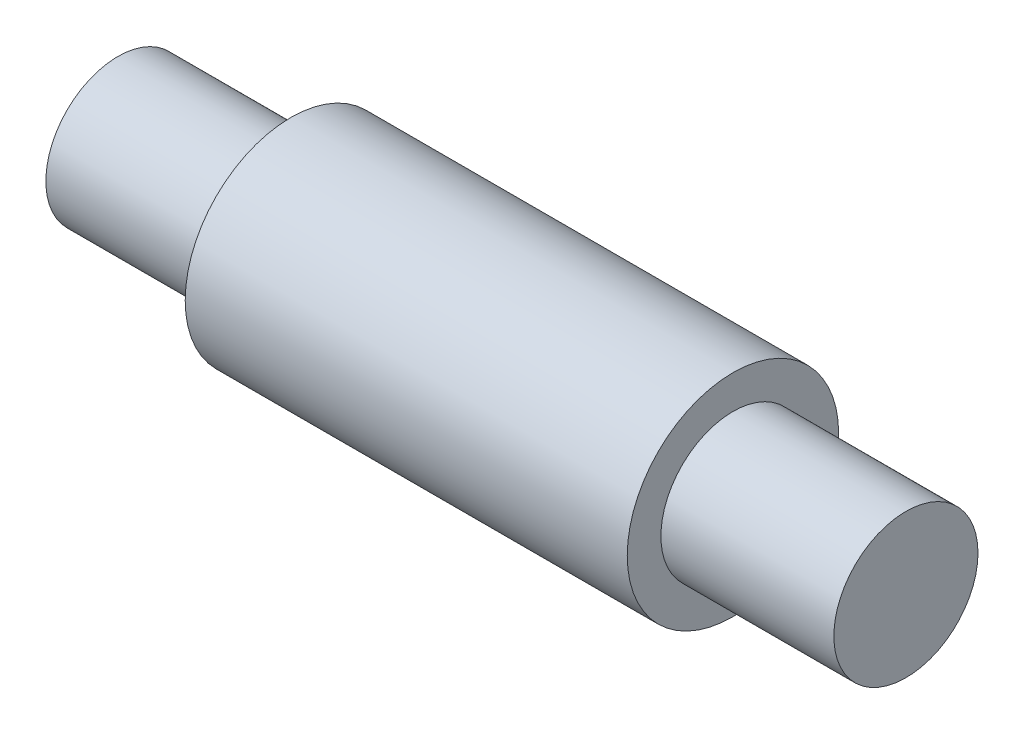
ISO-10303-21;
HEADER;
FILE_DESCRIPTION(('STEP AP214'),'2;1');
FILE_NAME('part.step','',(''),(''),'','','');
FILE_SCHEMA(('AUTOMOTIVE_DESIGN { 1 0 10303 214 1 1 1 1 }'));
ENDSEC;
DATA;
#1=APPLICATION_CONTEXT('core data for automotive mechanical design processes');
#2=APPLICATION_PROTOCOL_DEFINITION('international standard','automotive_design',2000,#1);
#3=PRODUCT_CONTEXT('',#1,'mechanical');
#4=PRODUCT('Part','Part','',(#3));
#5=PRODUCT_RELATED_PRODUCT_CATEGORY('part','',(#4));
#6=PRODUCT_DEFINITION_FORMATION('','',#4);
#7=PRODUCT_DEFINITION_CONTEXT('part definition',#1,'design');
#8=PRODUCT_DEFINITION('design','',#6,#7);
#9=PRODUCT_DEFINITION_SHAPE('','',#8);
#10=(LENGTH_UNIT() NAMED_UNIT(*) SI_UNIT(.MILLI.,.METRE.));
#11=(NAMED_UNIT(*) PLANE_ANGLE_UNIT() SI_UNIT($,.RADIAN.));
#12=(NAMED_UNIT(*) SI_UNIT($,.STERADIAN.) SOLID_ANGLE_UNIT());
#13=UNCERTAINTY_MEASURE_WITH_UNIT(LENGTH_MEASURE(1.E-05),#10,'distance_accuracy_value','');
#14=(GEOMETRIC_REPRESENTATION_CONTEXT(3) GLOBAL_UNCERTAINTY_ASSIGNED_CONTEXT((#13)) GLOBAL_UNIT_ASSIGNED_CONTEXT((#10,
#11,#12)) REPRESENTATION_CONTEXT('',''));
#15=CARTESIAN_POINT('',(0.,0.,0.));
#16=DIRECTION('',(0.,0.,1.));
#17=DIRECTION('',(1.,0.,0.));
#18=AXIS2_PLACEMENT_3D('',#15,#16,#17);
#19=CARTESIAN_POINT('',(41.,0.,0.));
#20=DIRECTION('',(-1.,0.,0.));
#21=DIRECTION('',(0.,0.,1.));
#22=AXIS2_PLACEMENT_3D('',#19,#20,#21);
#23=CYLINDRICAL_SURFACE('',#22,7.5);
#24=CARTESIAN_POINT('',(23.,0.,0.));
#25=DIRECTION('',(1.,0.,0.));
#26=DIRECTION('',(0.,0.,-1.));
#27=AXIS2_PLACEMENT_3D('',#24,#25,#26);
#28=CIRCLE('',#27,7.5);
#29=CARTESIAN_POINT('',(23.,0.,-7.5));
#30=VERTEX_POINT('',#29);
#31=EDGE_CURVE('E60',#30,#30,#28,.T.);
#32=ORIENTED_EDGE('',*,*,#31,.T.);
#33=EDGE_LOOP('',(#32));
#34=FACE_BOUND('',#33,.T.);
#35=CARTESIAN_POINT('',(41.,0.,0.));
#36=DIRECTION('',(1.,0.,0.));
#37=DIRECTION('',(0.,0.,-1.));
#38=AXIS2_PLACEMENT_3D('',#35,#36,#37);
#39=CIRCLE('',#38,7.5);
#40=CARTESIAN_POINT('',(41.,0.,-7.5));
#41=VERTEX_POINT('',#40);
#42=EDGE_CURVE('E46',#41,#41,#39,.T.);
#43=ORIENTED_EDGE('',*,*,#42,.F.);
#44=EDGE_LOOP('',(#43));
#45=FACE_BOUND('',#44,.T.);
#46=ADVANCED_FACE('F40',(#34,#45),#23,.T.);
#47=CARTESIAN_POINT('',(41.,0.,0.));
#48=DIRECTION('',(1.,0.,0.));
#49=DIRECTION('',(0.,0.,-1.));
#50=AXIS2_PLACEMENT_3D('',#47,#48,#49);
#51=PLANE('',#50);
#52=ORIENTED_EDGE('',*,*,#42,.T.);
#53=EDGE_LOOP('',(#52));
#54=FACE_BOUND('',#53,.T.);
#55=ADVANCED_FACE('F71',(#54),#51,.T.);
#56=CARTESIAN_POINT('',(23.,0.,0.));
#57=DIRECTION('',(1.,0.,0.));
#58=DIRECTION('',(0.,0.,-1.));
#59=AXIS2_PLACEMENT_3D('',#56,#57,#58);
#60=PLANE('',#59);
#61=CARTESIAN_POINT('',(23.,0.,0.));
#62=DIRECTION('',(1.,0.,0.));
#63=DIRECTION('',(0.,0.,-1.));
#64=AXIS2_PLACEMENT_3D('',#61,#62,#63);
#65=CIRCLE('',#64,11.);
#66=CARTESIAN_POINT('',(23.,0.,-11.));
#67=VERTEX_POINT('',#66);
#68=EDGE_CURVE('E55',#67,#67,#65,.T.);
#69=ORIENTED_EDGE('',*,*,#68,.T.);
#70=EDGE_LOOP('',(#69));
#71=FACE_BOUND('',#70,.T.);
#72=ORIENTED_EDGE('',*,*,#31,.F.);
#73=EDGE_LOOP('',(#72));
#74=FACE_BOUND('',#73,.T.);
#75=ADVANCED_FACE('F68',(#71,#74),#60,.T.);
#76=CARTESIAN_POINT('',(-23.,0.,0.));
#77=DIRECTION('',(1.,0.,0.));
#78=DIRECTION('',(0.,0.,-1.));
#79=AXIS2_PLACEMENT_3D('',#76,#77,#78);
#80=PLANE('',#79);
#81=CARTESIAN_POINT('',(-23.,0.,0.));
#82=DIRECTION('',(1.,0.,0.));
#83=DIRECTION('',(0.,0.,-1.));
#84=AXIS2_PLACEMENT_3D('',#81,#82,#83);
#85=CIRCLE('',#84,11.);
#86=CARTESIAN_POINT('',(-23.,0.,-11.));
#87=VERTEX_POINT('',#86);
#88=EDGE_CURVE('E57',#87,#87,#85,.T.);
#89=ORIENTED_EDGE('',*,*,#88,.F.);
#90=EDGE_LOOP('',(#89));
#91=FACE_BOUND('',#90,.T.);
#92=CARTESIAN_POINT('',(-23.,0.,0.));
#93=DIRECTION('',(1.,0.,0.));
#94=DIRECTION('',(0.,0.,-1.));
#95=AXIS2_PLACEMENT_3D('',#92,#93,#94);
#96=CIRCLE('',#95,7.5);
#97=CARTESIAN_POINT('',(-23.,0.,-7.5));
#98=VERTEX_POINT('',#97);
#99=EDGE_CURVE('E10',#98,#98,#96,.T.);
#100=ORIENTED_EDGE('',*,*,#99,.T.);
#101=EDGE_LOOP('',(#100));
#102=FACE_BOUND('',#101,.T.);
#103=ADVANCED_FACE('F70',(#91,#102),#80,.F.);
#104=CARTESIAN_POINT('',(23.,0.,0.));
#105=DIRECTION('',(-1.,0.,0.));
#106=DIRECTION('',(0.,0.,1.));
#107=AXIS2_PLACEMENT_3D('',#104,#105,#106);
#108=CYLINDRICAL_SURFACE('',#107,11.);
#109=ORIENTED_EDGE('',*,*,#68,.F.);
#110=EDGE_LOOP('',(#109));
#111=FACE_BOUND('',#110,.T.);
#112=ORIENTED_EDGE('',*,*,#88,.T.);
#113=EDGE_LOOP('',(#112));
#114=FACE_BOUND('',#113,.T.);
#115=ADVANCED_FACE('F78',(#111,#114),#108,.T.);
#116=CARTESIAN_POINT('',(-41.,0.,0.));
#117=DIRECTION('',(1.,0.,0.));
#118=DIRECTION('',(0.,0.,-1.));
#119=AXIS2_PLACEMENT_3D('',#116,#117,#118);
#120=PLANE('',#119);
#121=CARTESIAN_POINT('',(-41.,0.,0.));
#122=DIRECTION('',(1.,0.,0.));
#123=DIRECTION('',(0.,0.,-1.));
#124=AXIS2_PLACEMENT_3D('',#121,#122,#123);
#125=CIRCLE('',#124,7.5);
#126=CARTESIAN_POINT('',(-41.,0.,-7.5));
#127=VERTEX_POINT('',#126);
#128=EDGE_CURVE('E50',#127,#127,#125,.T.);
#129=ORIENTED_EDGE('',*,*,#128,.F.);
#130=EDGE_LOOP('',(#129));
#131=FACE_BOUND('',#130,.T.);
#132=ADVANCED_FACE('F87',(#131),#120,.F.);
#133=ORIENTED_EDGE('',*,*,#128,.T.);
#134=EDGE_LOOP('',(#133));
#135=FACE_BOUND('',#134,.T.);
#136=ORIENTED_EDGE('',*,*,#99,.F.);
#137=EDGE_LOOP('',(#136));
#138=FACE_BOUND('',#137,.T.);
#139=ADVANCED_FACE('F83',(#135,#138),#23,.T.);
#140=CLOSED_SHELL('',(#46,#55,#75,#103,#115,#132,#139));
#141=MANIFOLD_SOLID_BREP('B2',#140);
#142=ADVANCED_BREP_SHAPE_REPRESENTATION('',(#18,#141),#14);
#143=SHAPE_DEFINITION_REPRESENTATION(#9,#142);
ENDSEC;
END-ISO-10303-21;
